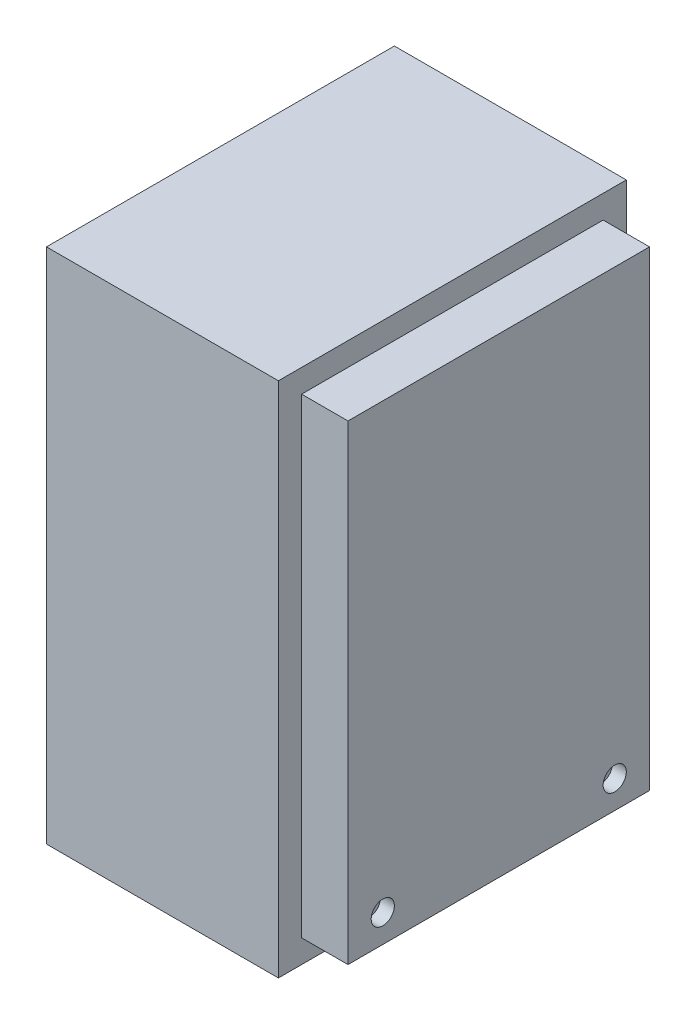
ISO-10303-21;
HEADER;
FILE_DESCRIPTION(('STEP AP214'),'2;1');
FILE_NAME('part.step','',(''),(''),'','','');
FILE_SCHEMA(('AUTOMOTIVE_DESIGN { 1 0 10303 214 1 1 1 1 }'));
ENDSEC;
DATA;
#1=APPLICATION_CONTEXT('core data for automotive mechanical design processes');
#2=APPLICATION_PROTOCOL_DEFINITION('international standard','automotive_design',2000,#1);
#3=PRODUCT_CONTEXT('',#1,'mechanical');
#4=PRODUCT('Part','Part','',(#3));
#5=PRODUCT_RELATED_PRODUCT_CATEGORY('part','',(#4));
#6=PRODUCT_DEFINITION_FORMATION('','',#4);
#7=PRODUCT_DEFINITION_CONTEXT('part definition',#1,'design');
#8=PRODUCT_DEFINITION('design','',#6,#7);
#9=PRODUCT_DEFINITION_SHAPE('','',#8);
#10=(LENGTH_UNIT() NAMED_UNIT(*) SI_UNIT(.MILLI.,.METRE.));
#11=(NAMED_UNIT(*) PLANE_ANGLE_UNIT() SI_UNIT($,.RADIAN.));
#12=(NAMED_UNIT(*) SI_UNIT($,.STERADIAN.) SOLID_ANGLE_UNIT());
#13=UNCERTAINTY_MEASURE_WITH_UNIT(LENGTH_MEASURE(1.E-05),#10,'distance_accuracy_value','');
#14=(GEOMETRIC_REPRESENTATION_CONTEXT(3) GLOBAL_UNCERTAINTY_ASSIGNED_CONTEXT((#13)) GLOBAL_UNIT_ASSIGNED_CONTEXT((#10,
#11,#12)) REPRESENTATION_CONTEXT('',''));
#15=CARTESIAN_POINT('',(0.,0.,0.));
#16=DIRECTION('',(0.,0.,1.));
#17=DIRECTION('',(1.,0.,0.));
#18=AXIS2_PLACEMENT_3D('',#15,#16,#17);
#19=CARTESIAN_POINT('',(100.,-111.5,75.));
#20=DIRECTION('',(0.,0.,-1.));
#21=DIRECTION('',(-1.,0.,0.));
#22=AXIS2_PLACEMENT_3D('',#19,#20,#21);
#23=PLANE('',#22);
#24=DIRECTION('',(0.,-1.,0.));
#25=VECTOR('',#24,1.);
#26=CARTESIAN_POINT('',(0.,-111.5,75.));
#27=LINE('',#26,#25);
#28=CARTESIAN_POINT('',(0.,111.5,75.));
#29=VERTEX_POINT('',#28);
#30=CARTESIAN_POINT('',(0.,-111.5,75.));
#31=VERTEX_POINT('',#30);
#32=EDGE_CURVE('E124',#29,#31,#27,.T.);
#33=ORIENTED_EDGE('',*,*,#32,.T.);
#34=DIRECTION('',(-1.,0.,0.));
#35=VECTOR('',#34,1.);
#36=CARTESIAN_POINT('',(100.,-111.5,75.));
#37=LINE('',#36,#35);
#38=CARTESIAN_POINT('',(100.,-111.5,75.));
#39=VERTEX_POINT('',#38);
#40=EDGE_CURVE('E11',#39,#31,#37,.T.);
#41=ORIENTED_EDGE('',*,*,#40,.F.);
#42=DIRECTION('',(0.,-1.,0.));
#43=VECTOR('',#42,1.);
#44=CARTESIAN_POINT('',(100.,-111.5,75.));
#45=LINE('',#44,#43);
#46=CARTESIAN_POINT('',(100.,111.5,75.));
#47=VERTEX_POINT('',#46);
#48=EDGE_CURVE('E133',#47,#39,#45,.T.);
#49=ORIENTED_EDGE('',*,*,#48,.F.);
#50=DIRECTION('',(-1.,0.,0.));
#51=VECTOR('',#50,1.);
#52=CARTESIAN_POINT('',(100.,111.5,75.));
#53=LINE('',#52,#51);
#54=EDGE_CURVE('E141',#47,#29,#53,.T.);
#55=ORIENTED_EDGE('',*,*,#54,.T.);
#56=EDGE_LOOP('',(#33,#41,#49,#55));
#57=FACE_BOUND('',#56,.T.);
#58=ADVANCED_FACE('F41',(#57),#23,.F.);
#59=CARTESIAN_POINT('',(100.,-111.5,-75.));
#60=DIRECTION('',(0.,1.,0.));
#61=DIRECTION('',(0.,0.,1.));
#62=AXIS2_PLACEMENT_3D('',#59,#60,#61);
#63=PLANE('',#62);
#64=DIRECTION('',(0.,0.,-1.));
#65=VECTOR('',#64,1.);
#66=CARTESIAN_POINT('',(0.,-111.5,-75.));
#67=LINE('',#66,#65);
#68=CARTESIAN_POINT('',(0.,-111.5,-75.));
#69=VERTEX_POINT('',#68);
#70=EDGE_CURVE('E126',#31,#69,#67,.T.);
#71=ORIENTED_EDGE('',*,*,#70,.T.);
#72=DIRECTION('',(-1.,0.,0.));
#73=VECTOR('',#72,1.);
#74=CARTESIAN_POINT('',(100.,-111.5,-75.));
#75=LINE('',#74,#73);
#76=CARTESIAN_POINT('',(100.,-111.5,-75.));
#77=VERTEX_POINT('',#76);
#78=EDGE_CURVE('E48',#77,#69,#75,.T.);
#79=ORIENTED_EDGE('',*,*,#78,.F.);
#80=DIRECTION('',(0.,0.,-1.));
#81=VECTOR('',#80,1.);
#82=CARTESIAN_POINT('',(100.,-111.5,-75.));
#83=LINE('',#82,#81);
#84=EDGE_CURVE('E140',#39,#77,#83,.T.);
#85=ORIENTED_EDGE('',*,*,#84,.F.);
#86=ORIENTED_EDGE('',*,*,#40,.T.);
#87=EDGE_LOOP('',(#71,#79,#85,#86));
#88=FACE_BOUND('',#87,.T.);
#89=ADVANCED_FACE('F173',(#88),#63,.F.);
#90=CARTESIAN_POINT('',(100.,-111.5,-75.));
#91=DIRECTION('',(0.,0.,1.));
#92=DIRECTION('',(1.,0.,0.));
#93=AXIS2_PLACEMENT_3D('',#90,#91,#92);
#94=PLANE('',#93);
#95=DIRECTION('',(0.,1.,0.));
#96=VECTOR('',#95,1.);
#97=CARTESIAN_POINT('',(0.,-111.5,-75.));
#98=LINE('',#97,#96);
#99=CARTESIAN_POINT('',(0.,111.5,-75.));
#100=VERTEX_POINT('',#99);
#101=EDGE_CURVE('E148',#69,#100,#98,.T.);
#102=ORIENTED_EDGE('',*,*,#101,.T.);
#103=DIRECTION('',(-1.,0.,0.));
#104=VECTOR('',#103,1.);
#105=CARTESIAN_POINT('',(100.,111.5,-75.));
#106=LINE('',#105,#104);
#107=CARTESIAN_POINT('',(100.,111.5,-75.));
#108=VERTEX_POINT('',#107);
#109=EDGE_CURVE('E151',#108,#100,#106,.T.);
#110=ORIENTED_EDGE('',*,*,#109,.F.);
#111=DIRECTION('',(0.,1.,0.));
#112=VECTOR('',#111,1.);
#113=CARTESIAN_POINT('',(100.,-111.5,-75.));
#114=LINE('',#113,#112);
#115=EDGE_CURVE('E139',#77,#108,#114,.T.);
#116=ORIENTED_EDGE('',*,*,#115,.F.);
#117=ORIENTED_EDGE('',*,*,#78,.T.);
#118=EDGE_LOOP('',(#102,#110,#116,#117));
#119=FACE_BOUND('',#118,.T.);
#120=ADVANCED_FACE('F158',(#119),#94,.F.);
#121=CARTESIAN_POINT('',(100.,111.5,-75.));
#122=DIRECTION('',(0.,-1.,0.));
#123=DIRECTION('',(0.,0.,-1.));
#124=AXIS2_PLACEMENT_3D('',#121,#122,#123);
#125=PLANE('',#124);
#126=DIRECTION('',(0.,0.,1.));
#127=VECTOR('',#126,1.);
#128=CARTESIAN_POINT('',(0.,111.5,-75.));
#129=LINE('',#128,#127);
#130=EDGE_CURVE('E137',#100,#29,#129,.T.);
#131=ORIENTED_EDGE('',*,*,#130,.T.);
#132=ORIENTED_EDGE('',*,*,#54,.F.);
#133=DIRECTION('',(0.,0.,1.));
#134=VECTOR('',#133,1.);
#135=CARTESIAN_POINT('',(100.,111.5,-75.));
#136=LINE('',#135,#134);
#137=EDGE_CURVE('E142',#108,#47,#136,.T.);
#138=ORIENTED_EDGE('',*,*,#137,.F.);
#139=ORIENTED_EDGE('',*,*,#109,.T.);
#140=EDGE_LOOP('',(#131,#132,#138,#139));
#141=FACE_BOUND('',#140,.T.);
#142=ADVANCED_FACE('F170',(#141),#125,.F.);
#143=CARTESIAN_POINT('',(100.,0.,0.));
#144=DIRECTION('',(1.,0.,0.));
#145=DIRECTION('',(0.,0.,-1.));
#146=AXIS2_PLACEMENT_3D('',#143,#144,#145);
#147=PLANE('',#146);
#148=DIRECTION('',(0.,-1.,0.));
#149=VECTOR('',#148,1.);
#150=CARTESIAN_POINT('',(100.,-101.5,65.));
#151=LINE('',#150,#149);
#152=CARTESIAN_POINT('',(100.,101.5,65.));
#153=VERTEX_POINT('',#152);
#154=CARTESIAN_POINT('',(100.,-101.5,65.));
#155=VERTEX_POINT('',#154);
#156=EDGE_CURVE('E54',#153,#155,#151,.T.);
#157=ORIENTED_EDGE('',*,*,#156,.F.);
#158=DIRECTION('',(0.,0.,1.));
#159=VECTOR('',#158,1.);
#160=CARTESIAN_POINT('',(100.,101.5,-65.));
#161=LINE('',#160,#159);
#162=CARTESIAN_POINT('',(100.,101.5,-65.));
#163=VERTEX_POINT('',#162);
#164=EDGE_CURVE('E56',#163,#153,#161,.T.);
#165=ORIENTED_EDGE('',*,*,#164,.F.);
#166=DIRECTION('',(0.,1.,0.));
#167=VECTOR('',#166,1.);
#168=CARTESIAN_POINT('',(100.,-101.5,-65.));
#169=LINE('',#168,#167);
#170=CARTESIAN_POINT('',(100.,-101.5,-65.));
#171=VERTEX_POINT('',#170);
#172=EDGE_CURVE('E238',#171,#163,#169,.T.);
#173=ORIENTED_EDGE('',*,*,#172,.F.);
#174=DIRECTION('',(0.,0.,-1.));
#175=VECTOR('',#174,1.);
#176=CARTESIAN_POINT('',(100.,-101.5,-65.));
#177=LINE('',#176,#175);
#178=EDGE_CURVE('E223',#155,#171,#177,.T.);
#179=ORIENTED_EDGE('',*,*,#178,.F.);
#180=EDGE_LOOP('',(#157,#165,#173,#179));
#181=FACE_BOUND('',#180,.T.);
#182=ORIENTED_EDGE('',*,*,#48,.T.);
#183=ORIENTED_EDGE('',*,*,#84,.T.);
#184=ORIENTED_EDGE('',*,*,#115,.T.);
#185=ORIENTED_EDGE('',*,*,#137,.T.);
#186=EDGE_LOOP('',(#182,#183,#184,#185));
#187=FACE_BOUND('',#186,.T.);
#188=ADVANCED_FACE('F172',(#181,#187),#147,.T.);
#189=CARTESIAN_POINT('',(0.,0.,0.));
#190=DIRECTION('',(1.,0.,0.));
#191=DIRECTION('',(0.,0.,-1.));
#192=AXIS2_PLACEMENT_3D('',#189,#190,#191);
#193=PLANE('',#192);
#194=ORIENTED_EDGE('',*,*,#32,.F.);
#195=ORIENTED_EDGE('',*,*,#130,.F.);
#196=ORIENTED_EDGE('',*,*,#101,.F.);
#197=ORIENTED_EDGE('',*,*,#70,.F.);
#198=EDGE_LOOP('',(#194,#195,#196,#197));
#199=FACE_BOUND('',#198,.T.);
#200=ADVANCED_FACE('F163',(#199),#193,.F.);
#201=CARTESIAN_POINT('',(120.,-101.5,65.));
#202=DIRECTION('',(0.,0.,-1.));
#203=DIRECTION('',(-1.,0.,0.));
#204=AXIS2_PLACEMENT_3D('',#201,#202,#203);
#205=PLANE('',#204);
#206=ORIENTED_EDGE('',*,*,#156,.T.);
#207=DIRECTION('',(-1.,0.,0.));
#208=VECTOR('',#207,1.);
#209=CARTESIAN_POINT('',(120.,-101.5,65.));
#210=LINE('',#209,#208);
#211=CARTESIAN_POINT('',(120.,-101.5,65.));
#212=VERTEX_POINT('',#211);
#213=EDGE_CURVE('E107',#212,#155,#210,.T.);
#214=ORIENTED_EDGE('',*,*,#213,.F.);
#215=DIRECTION('',(0.,-1.,0.));
#216=VECTOR('',#215,1.);
#217=CARTESIAN_POINT('',(120.,-101.5,65.));
#218=LINE('',#217,#216);
#219=CARTESIAN_POINT('',(120.,101.5,65.));
#220=VERTEX_POINT('',#219);
#221=EDGE_CURVE('E111',#220,#212,#218,.T.);
#222=ORIENTED_EDGE('',*,*,#221,.F.);
#223=DIRECTION('',(-1.,0.,0.));
#224=VECTOR('',#223,1.);
#225=CARTESIAN_POINT('',(120.,101.5,65.));
#226=LINE('',#225,#224);
#227=EDGE_CURVE('E240',#220,#153,#226,.T.);
#228=ORIENTED_EDGE('',*,*,#227,.T.);
#229=EDGE_LOOP('',(#206,#214,#222,#228));
#230=FACE_BOUND('',#229,.T.);
#231=ADVANCED_FACE('F123',(#230),#205,.F.);
#232=CARTESIAN_POINT('',(120.,-101.5,-65.));
#233=DIRECTION('',(0.,1.,0.));
#234=DIRECTION('',(0.,0.,1.));
#235=AXIS2_PLACEMENT_3D('',#232,#233,#234);
#236=PLANE('',#235);
#237=ORIENTED_EDGE('',*,*,#178,.T.);
#238=DIRECTION('',(-1.,0.,0.));
#239=VECTOR('',#238,1.);
#240=CARTESIAN_POINT('',(120.,-101.5,-65.));
#241=LINE('',#240,#239);
#242=CARTESIAN_POINT('',(120.,-101.5,-65.));
#243=VERTEX_POINT('',#242);
#244=EDGE_CURVE('E109',#243,#171,#241,.T.);
#245=ORIENTED_EDGE('',*,*,#244,.F.);
#246=DIRECTION('',(0.,0.,-1.));
#247=VECTOR('',#246,1.);
#248=CARTESIAN_POINT('',(120.,-101.5,-65.));
#249=LINE('',#248,#247);
#250=EDGE_CURVE('E103',#212,#243,#249,.T.);
#251=ORIENTED_EDGE('',*,*,#250,.F.);
#252=ORIENTED_EDGE('',*,*,#213,.T.);
#253=EDGE_LOOP('',(#237,#245,#251,#252));
#254=FACE_BOUND('',#253,.T.);
#255=ADVANCED_FACE('F106',(#254),#236,.F.);
#256=CARTESIAN_POINT('',(120.,-101.5,-65.));
#257=DIRECTION('',(0.,0.,1.));
#258=DIRECTION('',(1.,0.,0.));
#259=AXIS2_PLACEMENT_3D('',#256,#257,#258);
#260=PLANE('',#259);
#261=ORIENTED_EDGE('',*,*,#172,.T.);
#262=DIRECTION('',(-1.,0.,0.));
#263=VECTOR('',#262,1.);
#264=CARTESIAN_POINT('',(120.,101.5,-65.));
#265=LINE('',#264,#263);
#266=CARTESIAN_POINT('',(120.,101.5,-65.));
#267=VERTEX_POINT('',#266);
#268=EDGE_CURVE('E128',#267,#163,#265,.T.);
#269=ORIENTED_EDGE('',*,*,#268,.F.);
#270=DIRECTION('',(0.,1.,0.));
#271=VECTOR('',#270,1.);
#272=CARTESIAN_POINT('',(120.,-101.5,-65.));
#273=LINE('',#272,#271);
#274=EDGE_CURVE('E114',#243,#267,#273,.T.);
#275=ORIENTED_EDGE('',*,*,#274,.F.);
#276=ORIENTED_EDGE('',*,*,#244,.T.);
#277=EDGE_LOOP('',(#261,#269,#275,#276));
#278=FACE_BOUND('',#277,.T.);
#279=ADVANCED_FACE('F195',(#278),#260,.F.);
#280=CARTESIAN_POINT('',(120.,101.5,-65.));
#281=DIRECTION('',(0.,-1.,0.));
#282=DIRECTION('',(0.,0.,-1.));
#283=AXIS2_PLACEMENT_3D('',#280,#281,#282);
#284=PLANE('',#283);
#285=ORIENTED_EDGE('',*,*,#164,.T.);
#286=ORIENTED_EDGE('',*,*,#227,.F.);
#287=DIRECTION('',(0.,0.,1.));
#288=VECTOR('',#287,1.);
#289=CARTESIAN_POINT('',(120.,101.5,-65.));
#290=LINE('',#289,#288);
#291=EDGE_CURVE('E118',#267,#220,#290,.T.);
#292=ORIENTED_EDGE('',*,*,#291,.F.);
#293=ORIENTED_EDGE('',*,*,#268,.T.);
#294=EDGE_LOOP('',(#285,#286,#292,#293));
#295=FACE_BOUND('',#294,.T.);
#296=ADVANCED_FACE('F194',(#295),#284,.F.);
#297=CARTESIAN_POINT('',(120.,0.,0.));
#298=DIRECTION('',(1.,0.,0.));
#299=DIRECTION('',(0.,0.,-1.));
#300=AXIS2_PLACEMENT_3D('',#297,#298,#299);
#301=PLANE('',#300);
#302=CARTESIAN_POINT('',(120.,-89.5,50.));
#303=DIRECTION('',(1.,0.,0.));
#304=DIRECTION('',(0.,0.,-1.));
#305=AXIS2_PLACEMENT_3D('',#302,#303,#304);
#306=CIRCLE('',#305,5.);
#307=CARTESIAN_POINT('',(120.,-89.5,45.));
#308=VERTEX_POINT('',#307);
#309=EDGE_CURVE('E224',#308,#308,#306,.T.);
#310=ORIENTED_EDGE('',*,*,#309,.F.);
#311=EDGE_LOOP('',(#310));
#312=FACE_BOUND('',#311,.T.);
#313=CARTESIAN_POINT('',(120.,-89.5,-50.));
#314=DIRECTION('',(1.,0.,0.));
#315=DIRECTION('',(0.,0.,-1.));
#316=AXIS2_PLACEMENT_3D('',#313,#314,#315);
#317=CIRCLE('',#316,5.);
#318=CARTESIAN_POINT('',(120.,-89.5,-55.));
#319=VERTEX_POINT('',#318);
#320=EDGE_CURVE('E227',#319,#319,#317,.T.);
#321=ORIENTED_EDGE('',*,*,#320,.F.);
#322=EDGE_LOOP('',(#321));
#323=FACE_BOUND('',#322,.T.);
#324=ORIENTED_EDGE('',*,*,#221,.T.);
#325=ORIENTED_EDGE('',*,*,#250,.T.);
#326=ORIENTED_EDGE('',*,*,#274,.T.);
#327=ORIENTED_EDGE('',*,*,#291,.T.);
#328=EDGE_LOOP('',(#324,#325,#326,#327));
#329=FACE_BOUND('',#328,.T.);
#330=ADVANCED_FACE('F120',(#312,#323,#329),#301,.T.);
#331=CARTESIAN_POINT('',(114.,-89.5,-50.));
#332=DIRECTION('',(1.,0.,0.));
#333=DIRECTION('',(0.,0.,-1.));
#334=AXIS2_PLACEMENT_3D('',#331,#332,#333);
#335=CYLINDRICAL_SURFACE('',#334,5.);
#336=CARTESIAN_POINT('',(114.,-89.5,-50.));
#337=DIRECTION('',(1.,0.,0.));
#338=DIRECTION('',(0.,0.,-1.));
#339=AXIS2_PLACEMENT_3D('',#336,#337,#338);
#340=CIRCLE('',#339,5.);
#341=CARTESIAN_POINT('',(114.,-89.5,-55.));
#342=VERTEX_POINT('',#341);
#343=EDGE_CURVE('E232',#342,#342,#340,.T.);
#344=ORIENTED_EDGE('',*,*,#343,.F.);
#345=EDGE_LOOP('',(#344));
#346=FACE_BOUND('',#345,.T.);
#347=ORIENTED_EDGE('',*,*,#320,.T.);
#348=EDGE_LOOP('',(#347));
#349=FACE_BOUND('',#348,.T.);
#350=ADVANCED_FACE('F205',(#346,#349),#335,.F.);
#351=CARTESIAN_POINT('',(114.,-89.5,-50.));
#352=DIRECTION('',(1.,0.,0.));
#353=DIRECTION('',(0.,0.,-1.));
#354=AXIS2_PLACEMENT_3D('',#351,#352,#353);
#355=PLANE('',#354);
#356=ORIENTED_EDGE('',*,*,#343,.T.);
#357=EDGE_LOOP('',(#356));
#358=FACE_BOUND('',#357,.T.);
#359=ADVANCED_FACE('F204',(#358),#355,.T.);
#360=CARTESIAN_POINT('',(114.,-89.5,50.));
#361=DIRECTION('',(1.,0.,0.));
#362=DIRECTION('',(0.,0.,-1.));
#363=AXIS2_PLACEMENT_3D('',#360,#361,#362);
#364=CYLINDRICAL_SURFACE('',#363,5.);
#365=CARTESIAN_POINT('',(114.,-89.5,50.));
#366=DIRECTION('',(1.,0.,0.));
#367=DIRECTION('',(0.,0.,-1.));
#368=AXIS2_PLACEMENT_3D('',#365,#366,#367);
#369=CIRCLE('',#368,5.);
#370=CARTESIAN_POINT('',(114.,-89.5,45.));
#371=VERTEX_POINT('',#370);
#372=EDGE_CURVE('E225',#371,#371,#369,.T.);
#373=ORIENTED_EDGE('',*,*,#372,.F.);
#374=EDGE_LOOP('',(#373));
#375=FACE_BOUND('',#374,.T.);
#376=ORIENTED_EDGE('',*,*,#309,.T.);
#377=EDGE_LOOP('',(#376));
#378=FACE_BOUND('',#377,.T.);
#379=ADVANCED_FACE('F210',(#375,#378),#364,.F.);
#380=CARTESIAN_POINT('',(114.,-89.5,50.));
#381=DIRECTION('',(1.,0.,0.));
#382=DIRECTION('',(0.,0.,-1.));
#383=AXIS2_PLACEMENT_3D('',#380,#381,#382);
#384=PLANE('',#383);
#385=ORIENTED_EDGE('',*,*,#372,.T.);
#386=EDGE_LOOP('',(#385));
#387=FACE_BOUND('',#386,.T.);
#388=ADVANCED_FACE('F212',(#387),#384,.T.);
#389=CLOSED_SHELL('',(#58,#89,#120,#142,#188,#200,#231,#255,#279,#296,#330,#350,#359,#379,#388));
#390=MANIFOLD_SOLID_BREP('B2',#389);
#391=ADVANCED_BREP_SHAPE_REPRESENTATION('',(#18,#390),#14);
#392=SHAPE_DEFINITION_REPRESENTATION(#9,#391);
ENDSEC;
END-ISO-10303-21;
